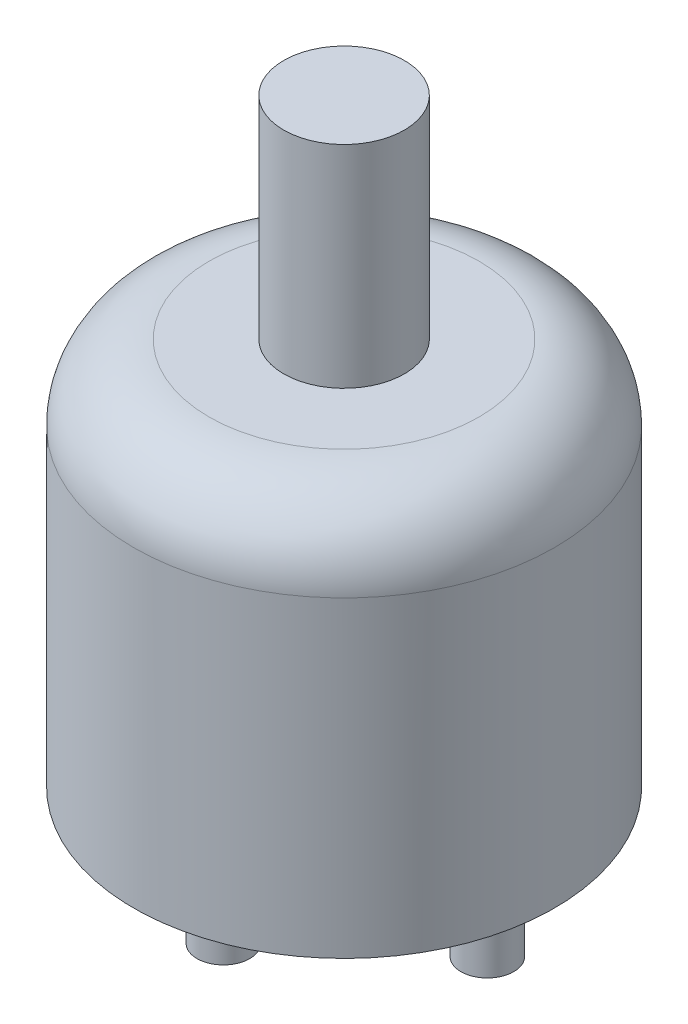
ISO-10303-21;
HEADER;
FILE_DESCRIPTION(('STEP AP214'),'2;1');
FILE_NAME('part.step','',(''),(''),'','','');
FILE_SCHEMA(('AUTOMOTIVE_DESIGN { 1 0 10303 214 1 1 1 1 }'));
ENDSEC;
DATA;
#1=APPLICATION_CONTEXT('core data for automotive mechanical design processes');
#2=APPLICATION_PROTOCOL_DEFINITION('international standard','automotive_design',2000,#1);
#3=PRODUCT_CONTEXT('',#1,'mechanical');
#4=PRODUCT('Part','Part','',(#3));
#5=PRODUCT_RELATED_PRODUCT_CATEGORY('part','',(#4));
#6=PRODUCT_DEFINITION_FORMATION('','',#4);
#7=PRODUCT_DEFINITION_CONTEXT('part definition',#1,'design');
#8=PRODUCT_DEFINITION('design','',#6,#7);
#9=PRODUCT_DEFINITION_SHAPE('','',#8);
#10=(LENGTH_UNIT() NAMED_UNIT(*) SI_UNIT(.MILLI.,.METRE.));
#11=(NAMED_UNIT(*) PLANE_ANGLE_UNIT() SI_UNIT($,.RADIAN.));
#12=(NAMED_UNIT(*) SI_UNIT($,.STERADIAN.) SOLID_ANGLE_UNIT());
#13=UNCERTAINTY_MEASURE_WITH_UNIT(LENGTH_MEASURE(1.E-05),#10,'distance_accuracy_value','');
#14=(GEOMETRIC_REPRESENTATION_CONTEXT(3) GLOBAL_UNCERTAINTY_ASSIGNED_CONTEXT((#13)) GLOBAL_UNIT_ASSIGNED_CONTEXT((#10,
#11,#12)) REPRESENTATION_CONTEXT('',''));
#15=CARTESIAN_POINT('',(0.,0.,0.));
#16=DIRECTION('',(0.,0.,1.));
#17=DIRECTION('',(1.,0.,0.));
#18=AXIS2_PLACEMENT_3D('',#15,#16,#17);
#19=CARTESIAN_POINT('',(0.,25.7,0.));
#20=DIRECTION('',(0.,-1.,0.));
#21=DIRECTION('',(0.,0.,-1.));
#22=AXIS2_PLACEMENT_3D('',#19,#20,#21);
#23=CYLINDRICAL_SURFACE('',#22,13.95);
#24=CARTESIAN_POINT('',(0.,20.7,0.));
#25=DIRECTION('',(0.,1.,0.));
#26=DIRECTION('',(0.,0.,1.));
#27=AXIS2_PLACEMENT_3D('',#24,#25,#26);
#28=CIRCLE('',#27,13.95);
#29=CARTESIAN_POINT('',(0.,20.7,-13.95));
#30=VERTEX_POINT('',#29);
#31=EDGE_CURVE('E72',#30,#30,#28,.F.);
#32=CARTESIAN_POINT('',(0.,0.,0.));
#33=DIRECTION('',(0.,1.,0.));
#34=DIRECTION('',(0.,0.,1.));
#35=AXIS2_PLACEMENT_3D('',#32,#33,#34);
#36=CIRCLE('',#35,13.95);
#37=CARTESIAN_POINT('',(0.,0.,-13.95));
#38=VERTEX_POINT('',#37);
#39=EDGE_CURVE('E80',#38,#38,#36,.T.);
#40=CARTESIAN_POINT('',(0.,20.7,-13.95));
#41=CARTESIAN_POINT('',(0.,20.484375,-13.95));
#42=CARTESIAN_POINT('',(0.,20.26875,-13.95));
#43=CARTESIAN_POINT('',(0.,19.8375,-13.95));
#44=CARTESIAN_POINT('',(0.,19.621875,-13.95));
#45=CARTESIAN_POINT('',(0.,19.190625,-13.95));
#46=CARTESIAN_POINT('',(0.,18.975,-13.95));
#47=CARTESIAN_POINT('',(0.,18.54375,-13.95));
#48=CARTESIAN_POINT('',(0.,18.328125,-13.95));
#49=CARTESIAN_POINT('',(0.,17.896875,-13.95));
#50=CARTESIAN_POINT('',(0.,17.68125,-13.95));
#51=CARTESIAN_POINT('',(0.,17.25,-13.95));
#52=CARTESIAN_POINT('',(0.,17.034375,-13.95));
#53=CARTESIAN_POINT('',(0.,16.603125,-13.95));
#54=CARTESIAN_POINT('',(0.,16.3875,-13.95));
#55=CARTESIAN_POINT('',(0.,15.95625,-13.95));
#56=CARTESIAN_POINT('',(0.,15.740625,-13.95));
#57=CARTESIAN_POINT('',(0.,15.309375,-13.95));
#58=CARTESIAN_POINT('',(0.,15.09375,-13.95));
#59=CARTESIAN_POINT('',(0.,14.6625,-13.95));
#60=CARTESIAN_POINT('',(0.,14.446875,-13.95));
#61=CARTESIAN_POINT('',(0.,14.015625,-13.95));
#62=CARTESIAN_POINT('',(0.,13.8,-13.95));
#63=CARTESIAN_POINT('',(0.,13.36875,-13.95));
#64=CARTESIAN_POINT('',(0.,13.153125,-13.95));
#65=CARTESIAN_POINT('',(0.,12.721875,-13.95));
#66=CARTESIAN_POINT('',(0.,12.50625,-13.95));
#67=CARTESIAN_POINT('',(0.,12.075,-13.95));
#68=CARTESIAN_POINT('',(0.,11.859375,-13.95));
#69=CARTESIAN_POINT('',(0.,11.428125,-13.95));
#70=CARTESIAN_POINT('',(0.,11.2125,-13.95));
#71=CARTESIAN_POINT('',(0.,10.78125,-13.95));
#72=CARTESIAN_POINT('',(0.,10.565625,-13.95));
#73=CARTESIAN_POINT('',(0.,10.134375,-13.95));
#74=CARTESIAN_POINT('',(0.,9.91875,-13.95));
#75=CARTESIAN_POINT('',(0.,9.4875,-13.95));
#76=CARTESIAN_POINT('',(0.,9.271875,-13.95));
#77=CARTESIAN_POINT('',(0.,8.840625,-13.95));
#78=CARTESIAN_POINT('',(0.,8.625,-13.95));
#79=CARTESIAN_POINT('',(0.,8.19375,-13.95));
#80=CARTESIAN_POINT('',(0.,7.978125,-13.95));
#81=CARTESIAN_POINT('',(0.,7.546875,-13.95));
#82=CARTESIAN_POINT('',(0.,7.33125,-13.95));
#83=CARTESIAN_POINT('',(0.,6.9,-13.95));
#84=CARTESIAN_POINT('',(0.,6.684375,-13.95));
#85=CARTESIAN_POINT('',(0.,6.253125,-13.95));
#86=CARTESIAN_POINT('',(0.,6.0375,-13.95));
#87=CARTESIAN_POINT('',(0.,5.60625,-13.95));
#88=CARTESIAN_POINT('',(0.,5.390625,-13.95));
#89=CARTESIAN_POINT('',(0.,4.959375,-13.95));
#90=CARTESIAN_POINT('',(0.,4.74375,-13.95));
#91=CARTESIAN_POINT('',(0.,4.3125,-13.95));
#92=CARTESIAN_POINT('',(0.,4.096875,-13.95));
#93=CARTESIAN_POINT('',(0.,3.665625,-13.95));
#94=CARTESIAN_POINT('',(0.,3.45,-13.95));
#95=CARTESIAN_POINT('',(0.,3.01875,-13.95));
#96=CARTESIAN_POINT('',(0.,2.803125,-13.95));
#97=CARTESIAN_POINT('',(0.,2.371875,-13.95));
#98=CARTESIAN_POINT('',(0.,2.15625,-13.95));
#99=CARTESIAN_POINT('',(0.,1.725,-13.95));
#100=CARTESIAN_POINT('',(0.,1.509375,-13.95));
#101=CARTESIAN_POINT('',(0.,1.078125,-13.95));
#102=CARTESIAN_POINT('',(0.,0.862499999999997,-13.95));
#103=CARTESIAN_POINT('',(0.,0.431249999999998,-13.95));
#104=CARTESIAN_POINT('',(0.,0.215624999999997,-13.95));
#105=CARTESIAN_POINT('',(0.,0.,-13.95));
#106=B_SPLINE_CURVE_WITH_KNOTS('',3,(#40,#41,#42,#43,#44,#45,#46,#47,#48,#49,#50,#51,#52,#53,
#54,#55,#56,#57,#58,#59,#60,#61,#62,#63,#64,#65,#66,#67,#68,#69,#70,#71,#72,#73,#74,#75,#76,#77,
#78,#79,#80,#81,#82,#83,#84,#85,#86,#87,#88,#89,#90,#91,#92,#93,#94,#95,#96,#97,#98,#99,#100,
#101,#102,#103,#104,#105),.UNSPECIFIED.,.F.,.F.,(4,2,2,2,2,2,2,2,2,2,2,2,2,2,2,2,2,2,2,2,2,2,2,
2,2,2,2,2,2,2,2,2,4),(0.,0.646874999999998,1.29375,1.940625,2.5875,3.234375,3.88125,4.528125,
5.175,5.821875,6.46875,7.115625,7.7625,8.409375,9.05625,9.703125,10.35,10.996875,11.64375,
12.290625,12.9375,13.584375,14.23125,14.878125,15.525,16.171875,16.81875,17.465625,18.1125,
18.759375,19.40625,20.053125,20.7),.UNSPECIFIED.);
#107=EDGE_CURVE('BSEAM48',#30,#38,#106,.T.);
#108=ORIENTED_EDGE('',*,*,#31,.T.);
#109=ORIENTED_EDGE('',*,*,#39,.T.);
#110=ORIENTED_EDGE('',*,*,#107,.T.);
#111=ORIENTED_EDGE('',*,*,#107,.F.);
#112=EDGE_LOOP('',(#108,#110,#109,#111));
#113=FACE_BOUND('',#112,.T.);
#114=ADVANCED_FACE('F48',(#113),#23,.T.);
#115=CARTESIAN_POINT('',(0.,25.7,0.));
#116=DIRECTION('',(0.,1.,0.));
#117=DIRECTION('',(0.,0.,1.));
#118=AXIS2_PLACEMENT_3D('',#115,#116,#117);
#119=PLANE('',#118);
#120=CARTESIAN_POINT('',(0.,25.7,0.));
#121=DIRECTION('',(0.,1.,0.));
#122=DIRECTION('',(0.,0.,1.));
#123=AXIS2_PLACEMENT_3D('',#120,#121,#122);
#124=CIRCLE('',#123,4.);
#125=CARTESIAN_POINT('',(0.,25.7,4.));
#126=VERTEX_POINT('',#125);
#127=EDGE_CURVE('E85',#126,#126,#124,.T.);
#128=ORIENTED_EDGE('',*,*,#127,.F.);
#129=EDGE_LOOP('',(#128));
#130=FACE_BOUND('',#129,.T.);
#131=CARTESIAN_POINT('',(0.,25.7,0.));
#132=DIRECTION('',(0.,1.,0.));
#133=DIRECTION('',(0.,0.,1.));
#134=AXIS2_PLACEMENT_3D('',#131,#132,#133);
#135=CIRCLE('',#134,8.95);
#136=CARTESIAN_POINT('',(0.,25.7,8.95));
#137=VERTEX_POINT('',#136);
#138=EDGE_CURVE('E76',#137,#137,#135,.T.);
#139=ORIENTED_EDGE('',*,*,#138,.T.);
#140=EDGE_LOOP('',(#139));
#141=FACE_BOUND('',#140,.T.);
#142=ADVANCED_FACE('F124',(#130,#141),#119,.T.);
#143=CARTESIAN_POINT('',(0.,0.,0.));
#144=DIRECTION('',(0.,1.,0.));
#145=DIRECTION('',(0.,0.,1.));
#146=AXIS2_PLACEMENT_3D('',#143,#144,#145);
#147=PLANE('',#146);
#148=CARTESIAN_POINT('',(0.,0.,-8.));
#149=DIRECTION('',(0.,1.,0.));
#150=DIRECTION('',(0.,0.,1.));
#151=AXIS2_PLACEMENT_3D('',#148,#149,#150);
#152=CIRCLE('',#151,1.75);
#153=CARTESIAN_POINT('',(0.,0.,-6.25));
#154=VERTEX_POINT('',#153);
#155=EDGE_CURVE('E11',#154,#154,#152,.F.);
#156=ORIENTED_EDGE('',*,*,#155,.F.);
#157=EDGE_LOOP('',(#156));
#158=FACE_BOUND('',#157,.T.);
#159=CARTESIAN_POINT('',(9.5,0.,0.));
#160=DIRECTION('',(0.,1.,0.));
#161=DIRECTION('',(0.,0.,1.));
#162=AXIS2_PLACEMENT_3D('',#159,#160,#161);
#163=CIRCLE('',#162,1.75);
#164=CARTESIAN_POINT('',(9.5,0.,1.75));
#165=VERTEX_POINT('',#164);
#166=EDGE_CURVE('E56',#165,#165,#163,.F.);
#167=ORIENTED_EDGE('',*,*,#166,.F.);
#168=EDGE_LOOP('',(#167));
#169=FACE_BOUND('',#168,.T.);
#170=CARTESIAN_POINT('',(-9.5,0.,0.));
#171=DIRECTION('',(0.,1.,0.));
#172=DIRECTION('',(0.,0.,1.));
#173=AXIS2_PLACEMENT_3D('',#170,#171,#172);
#174=CIRCLE('',#173,1.75);
#175=CARTESIAN_POINT('',(-9.5,0.,1.75));
#176=VERTEX_POINT('',#175);
#177=EDGE_CURVE('E61',#176,#176,#174,.F.);
#178=ORIENTED_EDGE('',*,*,#177,.F.);
#179=EDGE_LOOP('',(#178));
#180=FACE_BOUND('',#179,.T.);
#181=CARTESIAN_POINT('',(0.,0.,8.));
#182=DIRECTION('',(0.,1.,0.));
#183=DIRECTION('',(0.,0.,1.));
#184=AXIS2_PLACEMENT_3D('',#181,#182,#183);
#185=CIRCLE('',#184,1.75);
#186=CARTESIAN_POINT('',(0.,0.,9.75));
#187=VERTEX_POINT('',#186);
#188=EDGE_CURVE('E66',#187,#187,#185,.F.);
#189=ORIENTED_EDGE('',*,*,#188,.F.);
#190=EDGE_LOOP('',(#189));
#191=FACE_BOUND('',#190,.T.);
#192=ORIENTED_EDGE('',*,*,#39,.F.);
#193=EDGE_LOOP('',(#192));
#194=FACE_BOUND('',#193,.T.);
#195=ADVANCED_FACE('F129',(#158,#169,#180,#191,#194),#147,.F.);
#196=CARTESIAN_POINT('',(0.,20.7,0.));
#197=DIRECTION('',(0.,1.,0.));
#198=DIRECTION('',(0.,0.,1.));
#199=AXIS2_PLACEMENT_3D('',#196,#197,#198);
#200=TOROIDAL_SURFACE('',#199,8.95,5.);
#201=ORIENTED_EDGE('',*,*,#31,.F.);
#202=EDGE_LOOP('',(#201));
#203=FACE_BOUND('',#202,.T.);
#204=ORIENTED_EDGE('',*,*,#138,.F.);
#205=EDGE_LOOP('',(#204));
#206=FACE_BOUND('',#205,.T.);
#207=ADVANCED_FACE('F50',(#203,#206),#200,.T.);
#208=CARTESIAN_POINT('',(0.,39.7,0.));
#209=DIRECTION('',(0.,-1.,0.));
#210=DIRECTION('',(0.,0.,-1.));
#211=AXIS2_PLACEMENT_3D('',#208,#209,#210);
#212=CYLINDRICAL_SURFACE('',#211,4.);
#213=CARTESIAN_POINT('',(0.,39.7,0.));
#214=DIRECTION('',(0.,1.,0.));
#215=DIRECTION('',(0.,0.,1.));
#216=AXIS2_PLACEMENT_3D('',#213,#214,#215);
#217=CIRCLE('',#216,4.);
#218=CARTESIAN_POINT('',(0.,39.7,4.));
#219=VERTEX_POINT('',#218);
#220=EDGE_CURVE('E84',#219,#219,#217,.T.);
#221=ORIENTED_EDGE('',*,*,#220,.F.);
#222=EDGE_LOOP('',(#221));
#223=FACE_BOUND('',#222,.T.);
#224=ORIENTED_EDGE('',*,*,#127,.T.);
#225=EDGE_LOOP('',(#224));
#226=FACE_BOUND('',#225,.T.);
#227=ADVANCED_FACE('F137',(#223,#226),#212,.T.);
#228=CARTESIAN_POINT('',(0.,39.7,0.));
#229=DIRECTION('',(0.,1.,0.));
#230=DIRECTION('',(0.,0.,1.));
#231=AXIS2_PLACEMENT_3D('',#228,#229,#230);
#232=PLANE('',#231);
#233=ORIENTED_EDGE('',*,*,#220,.T.);
#234=EDGE_LOOP('',(#233));
#235=FACE_BOUND('',#234,.T.);
#236=ADVANCED_FACE('F140',(#235),#232,.T.);
#237=CARTESIAN_POINT('',(0.,-5.,8.));
#238=DIRECTION('',(0.,1.,0.));
#239=DIRECTION('',(0.,0.,1.));
#240=AXIS2_PLACEMENT_3D('',#237,#238,#239);
#241=CYLINDRICAL_SURFACE('',#240,1.75);
#242=CARTESIAN_POINT('',(0.,-5.,8.));
#243=DIRECTION('',(0.,-1.,0.));
#244=DIRECTION('',(0.,0.,-1.));
#245=AXIS2_PLACEMENT_3D('',#242,#243,#244);
#246=CIRCLE('',#245,1.75);
#247=CARTESIAN_POINT('',(0.,-5.,6.25));
#248=VERTEX_POINT('',#247);
#249=EDGE_CURVE('E89',#248,#248,#246,.T.);
#250=ORIENTED_EDGE('',*,*,#249,.F.);
#251=EDGE_LOOP('',(#250));
#252=FACE_BOUND('',#251,.T.);
#253=ORIENTED_EDGE('',*,*,#188,.T.);
#254=EDGE_LOOP('',(#253));
#255=FACE_BOUND('',#254,.T.);
#256=ADVANCED_FACE('F144',(#252,#255),#241,.T.);
#257=CARTESIAN_POINT('',(0.,-5.,0.));
#258=DIRECTION('',(0.,-1.,0.));
#259=DIRECTION('',(0.,0.,-1.));
#260=AXIS2_PLACEMENT_3D('',#257,#258,#259);
#261=PLANE('',#260);
#262=ORIENTED_EDGE('',*,*,#249,.T.);
#263=EDGE_LOOP('',(#262));
#264=FACE_BOUND('',#263,.T.);
#265=ADVANCED_FACE('F148',(#264),#261,.T.);
#266=CARTESIAN_POINT('',(-9.5,-5.,0.));
#267=DIRECTION('',(0.,1.,0.));
#268=DIRECTION('',(0.,0.,1.));
#269=AXIS2_PLACEMENT_3D('',#266,#267,#268);
#270=CYLINDRICAL_SURFACE('',#269,1.75);
#271=CARTESIAN_POINT('',(-9.5,-5.,0.));
#272=DIRECTION('',(0.,-1.,0.));
#273=DIRECTION('',(0.,0.,-1.));
#274=AXIS2_PLACEMENT_3D('',#271,#272,#273);
#275=CIRCLE('',#274,1.75);
#276=CARTESIAN_POINT('',(-9.5,-5.,-1.75));
#277=VERTEX_POINT('',#276);
#278=EDGE_CURVE('E96',#277,#277,#275,.T.);
#279=ORIENTED_EDGE('',*,*,#278,.F.);
#280=EDGE_LOOP('',(#279));
#281=FACE_BOUND('',#280,.T.);
#282=ORIENTED_EDGE('',*,*,#177,.T.);
#283=EDGE_LOOP('',(#282));
#284=FACE_BOUND('',#283,.T.);
#285=ADVANCED_FACE('F152',(#281,#284),#270,.T.);
#286=CARTESIAN_POINT('',(0.,-5.,0.));
#287=DIRECTION('',(0.,-1.,0.));
#288=DIRECTION('',(0.,0.,-1.));
#289=AXIS2_PLACEMENT_3D('',#286,#287,#288);
#290=PLANE('',#289);
#291=ORIENTED_EDGE('',*,*,#278,.T.);
#292=EDGE_LOOP('',(#291));
#293=FACE_BOUND('',#292,.T.);
#294=ADVANCED_FACE('F154',(#293),#290,.T.);
#295=CARTESIAN_POINT('',(9.5,-5.,0.));
#296=DIRECTION('',(0.,1.,0.));
#297=DIRECTION('',(0.,0.,1.));
#298=AXIS2_PLACEMENT_3D('',#295,#296,#297);
#299=CYLINDRICAL_SURFACE('',#298,1.75);
#300=CARTESIAN_POINT('',(9.5,-5.,0.));
#301=DIRECTION('',(0.,-1.,0.));
#302=DIRECTION('',(0.,0.,-1.));
#303=AXIS2_PLACEMENT_3D('',#300,#301,#302);
#304=CIRCLE('',#303,1.75);
#305=CARTESIAN_POINT('',(9.5,-5.,-1.75));
#306=VERTEX_POINT('',#305);
#307=EDGE_CURVE('E100',#306,#306,#304,.T.);
#308=ORIENTED_EDGE('',*,*,#307,.F.);
#309=EDGE_LOOP('',(#308));
#310=FACE_BOUND('',#309,.T.);
#311=ORIENTED_EDGE('',*,*,#166,.T.);
#312=EDGE_LOOP('',(#311));
#313=FACE_BOUND('',#312,.T.);
#314=ADVANCED_FACE('F120',(#310,#313),#299,.T.);
#315=CARTESIAN_POINT('',(0.,-5.,0.));
#316=DIRECTION('',(0.,-1.,0.));
#317=DIRECTION('',(0.,0.,-1.));
#318=AXIS2_PLACEMENT_3D('',#315,#316,#317);
#319=PLANE('',#318);
#320=ORIENTED_EDGE('',*,*,#307,.T.);
#321=EDGE_LOOP('',(#320));
#322=FACE_BOUND('',#321,.T.);
#323=ADVANCED_FACE('F113',(#322),#319,.T.);
#324=CARTESIAN_POINT('',(0.,-5.,-8.));
#325=DIRECTION('',(0.,1.,0.));
#326=DIRECTION('',(0.,0.,1.));
#327=AXIS2_PLACEMENT_3D('',#324,#325,#326);
#328=CYLINDRICAL_SURFACE('',#327,1.75);
#329=ORIENTED_EDGE('',*,*,#155,.T.);
#330=EDGE_LOOP('',(#329));
#331=FACE_BOUND('',#330,.T.);
#332=CARTESIAN_POINT('',(0.,-5.,-8.));
#333=DIRECTION('',(0.,-1.,0.));
#334=DIRECTION('',(0.,0.,-1.));
#335=AXIS2_PLACEMENT_3D('',#332,#333,#334);
#336=CIRCLE('',#335,1.75);
#337=CARTESIAN_POINT('',(0.,-5.,-9.75));
#338=VERTEX_POINT('',#337);
#339=EDGE_CURVE('E104',#338,#338,#336,.T.);
#340=ORIENTED_EDGE('',*,*,#339,.F.);
#341=EDGE_LOOP('',(#340));
#342=FACE_BOUND('',#341,.T.);
#343=ADVANCED_FACE('F111',(#331,#342),#328,.T.);
#344=CARTESIAN_POINT('',(0.,-5.,0.));
#345=DIRECTION('',(0.,-1.,0.));
#346=DIRECTION('',(0.,0.,-1.));
#347=AXIS2_PLACEMENT_3D('',#344,#345,#346);
#348=PLANE('',#347);
#349=ORIENTED_EDGE('',*,*,#339,.T.);
#350=EDGE_LOOP('',(#349));
#351=FACE_BOUND('',#350,.T.);
#352=ADVANCED_FACE('F109',(#351),#348,.T.);
#353=CLOSED_SHELL('',(#114,#142,#195,#207,#227,#236,#256,#265,#285,#294,#314,#323,#343,#352));
#354=MANIFOLD_SOLID_BREP('B2',#353);
#355=ADVANCED_BREP_SHAPE_REPRESENTATION('',(#18,#354),#14);
#356=SHAPE_DEFINITION_REPRESENTATION(#9,#355);
ENDSEC;
END-ISO-10303-21;
